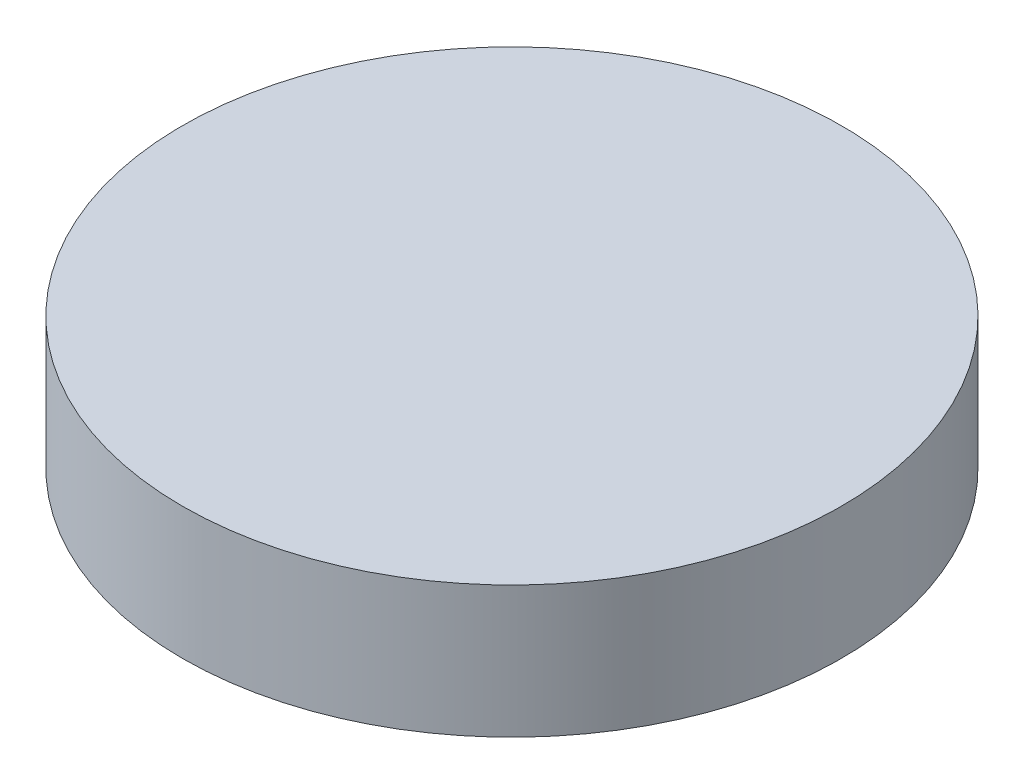
ISO-10303-21;
HEADER;
FILE_DESCRIPTION(('STEP AP214'),'2;1');
FILE_NAME('part.step','',(''),(''),'','','');
FILE_SCHEMA(('AUTOMOTIVE_DESIGN { 1 0 10303 214 1 1 1 1 }'));
ENDSEC;
DATA;
#1=APPLICATION_CONTEXT('core data for automotive mechanical design processes');
#2=APPLICATION_PROTOCOL_DEFINITION('international standard','automotive_design',2000,#1);
#3=PRODUCT_CONTEXT('',#1,'mechanical');
#4=PRODUCT('Part','Part','',(#3));
#5=PRODUCT_RELATED_PRODUCT_CATEGORY('part','',(#4));
#6=PRODUCT_DEFINITION_FORMATION('','',#4);
#7=PRODUCT_DEFINITION_CONTEXT('part definition',#1,'design');
#8=PRODUCT_DEFINITION('design','',#6,#7);
#9=PRODUCT_DEFINITION_SHAPE('','',#8);
#10=(LENGTH_UNIT() NAMED_UNIT(*) SI_UNIT(.MILLI.,.METRE.));
#11=(NAMED_UNIT(*) PLANE_ANGLE_UNIT() SI_UNIT($,.RADIAN.));
#12=(NAMED_UNIT(*) SI_UNIT($,.STERADIAN.) SOLID_ANGLE_UNIT());
#13=UNCERTAINTY_MEASURE_WITH_UNIT(LENGTH_MEASURE(1.E-05),#10,'distance_accuracy_value','');
#14=(GEOMETRIC_REPRESENTATION_CONTEXT(3) GLOBAL_UNCERTAINTY_ASSIGNED_CONTEXT((#13)) GLOBAL_UNIT_ASSIGNED_CONTEXT((#10,
#11,#12)) REPRESENTATION_CONTEXT('',''));
#15=CARTESIAN_POINT('',(0.,0.,0.));
#16=DIRECTION('',(0.,0.,1.));
#17=DIRECTION('',(1.,0.,0.));
#18=AXIS2_PLACEMENT_3D('',#15,#16,#17);
#19=CARTESIAN_POINT('',(0.,12.7,0.));
#20=DIRECTION('',(0.,-1.,0.));
#21=DIRECTION('',(0.,0.,-1.));
#22=AXIS2_PLACEMENT_3D('',#19,#20,#21);
#23=CYLINDRICAL_SURFACE('',#22,31.75);
#24=CARTESIAN_POINT('',(0.,12.7,0.));
#25=DIRECTION('',(0.,1.,0.));
#26=DIRECTION('',(0.,0.,1.));
#27=AXIS2_PLACEMENT_3D('',#24,#25,#26);
#28=CIRCLE('',#27,31.75);
#29=CARTESIAN_POINT('',(0.,12.7,31.75));
#30=VERTEX_POINT('',#29);
#31=EDGE_CURVE('E10',#30,#30,#28,.T.);
#32=ORIENTED_EDGE('',*,*,#31,.F.);
#33=EDGE_LOOP('',(#32));
#34=FACE_BOUND('',#33,.T.);
#35=CARTESIAN_POINT('',(0.,0.,0.));
#36=DIRECTION('',(0.,1.,0.));
#37=DIRECTION('',(0.,0.,1.));
#38=AXIS2_PLACEMENT_3D('',#35,#36,#37);
#39=CIRCLE('',#38,31.75);
#40=CARTESIAN_POINT('',(0.,0.,31.75));
#41=VERTEX_POINT('',#40);
#42=EDGE_CURVE('E40',#41,#41,#39,.T.);
#43=ORIENTED_EDGE('',*,*,#42,.T.);
#44=EDGE_LOOP('',(#43));
#45=FACE_BOUND('',#44,.T.);
#46=ADVANCED_FACE('F37',(#34,#45),#23,.T.);
#47=CARTESIAN_POINT('',(0.,12.7,0.));
#48=DIRECTION('',(0.,1.,0.));
#49=DIRECTION('',(0.,0.,1.));
#50=AXIS2_PLACEMENT_3D('',#47,#48,#49);
#51=PLANE('',#50);
#52=ORIENTED_EDGE('',*,*,#31,.T.);
#53=EDGE_LOOP('',(#52));
#54=FACE_BOUND('',#53,.T.);
#55=ADVANCED_FACE('F52',(#54),#51,.T.);
#56=CARTESIAN_POINT('',(0.,0.,0.));
#57=DIRECTION('',(0.,1.,0.));
#58=DIRECTION('',(0.,0.,1.));
#59=AXIS2_PLACEMENT_3D('',#56,#57,#58);
#60=PLANE('',#59);
#61=ORIENTED_EDGE('',*,*,#42,.F.);
#62=EDGE_LOOP('',(#61));
#63=FACE_BOUND('',#62,.T.);
#64=ADVANCED_FACE('F50',(#63),#60,.F.);
#65=CLOSED_SHELL('',(#46,#55,#64));
#66=MANIFOLD_SOLID_BREP('B2',#65);
#67=ADVANCED_BREP_SHAPE_REPRESENTATION('',(#18,#66),#14);
#68=SHAPE_DEFINITION_REPRESENTATION(#9,#67);
ENDSEC;
END-ISO-10303-21;
